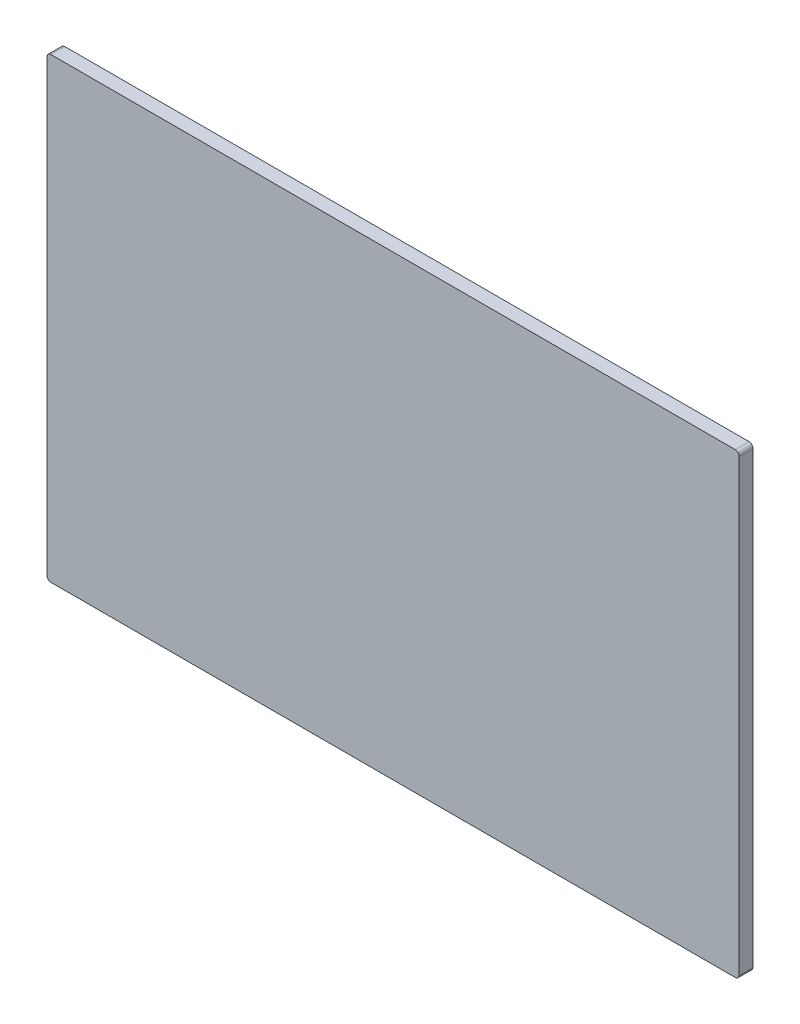
ISO-10303-21;
HEADER;
FILE_DESCRIPTION(('STEP AP214'),'2;1');
FILE_NAME('part.step','',(''),(''),'','','');
FILE_SCHEMA(('AUTOMOTIVE_DESIGN { 1 0 10303 214 1 1 1 1 }'));
ENDSEC;
DATA;
#1=APPLICATION_CONTEXT('core data for automotive mechanical design processes');
#2=APPLICATION_PROTOCOL_DEFINITION('international standard','automotive_design',2000,#1);
#3=PRODUCT_CONTEXT('',#1,'mechanical');
#4=PRODUCT('Part','Part','',(#3));
#5=PRODUCT_RELATED_PRODUCT_CATEGORY('part','',(#4));
#6=PRODUCT_DEFINITION_FORMATION('','',#4);
#7=PRODUCT_DEFINITION_CONTEXT('part definition',#1,'design');
#8=PRODUCT_DEFINITION('design','',#6,#7);
#9=PRODUCT_DEFINITION_SHAPE('','',#8);
#10=(LENGTH_UNIT() NAMED_UNIT(*) SI_UNIT(.MILLI.,.METRE.));
#11=(NAMED_UNIT(*) PLANE_ANGLE_UNIT() SI_UNIT($,.RADIAN.));
#12=(NAMED_UNIT(*) SI_UNIT($,.STERADIAN.) SOLID_ANGLE_UNIT());
#13=UNCERTAINTY_MEASURE_WITH_UNIT(LENGTH_MEASURE(1.E-05),#10,'distance_accuracy_value','');
#14=(GEOMETRIC_REPRESENTATION_CONTEXT(3) GLOBAL_UNCERTAINTY_ASSIGNED_CONTEXT((#13)) GLOBAL_UNIT_ASSIGNED_CONTEXT((#10,
#11,#12)) REPRESENTATION_CONTEXT('',''));
#15=CARTESIAN_POINT('',(0.,0.,0.));
#16=DIRECTION('',(0.,0.,1.));
#17=DIRECTION('',(1.,0.,0.));
#18=AXIS2_PLACEMENT_3D('',#15,#16,#17);
#19=CARTESIAN_POINT('',(960.,30.533000000003,17.4));
#20=DIRECTION('',(0.,0.,1.));
#21=DIRECTION('',(1.,0.,0.));
#22=AXIS2_PLACEMENT_3D('',#19,#20,#21);
#23=CYLINDRICAL_SURFACE('',#22,5.);
#24=DIRECTION('',(0.,0.,1.));
#25=VECTOR('',#24,1.);
#26=CARTESIAN_POINT('',(960.,25.533000000003,17.4));
#27=LINE('',#26,#25);
#28=CARTESIAN_POINT('',(960.,25.533000000003,0.));
#29=VERTEX_POINT('',#28);
#30=CARTESIAN_POINT('',(960.,25.533000000003,17.4));
#31=VERTEX_POINT('',#30);
#32=EDGE_CURVE('E153',#29,#31,#27,.T.);
#33=ORIENTED_EDGE('',*,*,#32,.F.);
#34=CARTESIAN_POINT('',(960.,30.533000000003,0.));
#35=DIRECTION('',(0.,0.,-1.));
#36=DIRECTION('',(-1.,0.,0.));
#37=AXIS2_PLACEMENT_3D('',#34,#35,#36);
#38=CIRCLE('',#37,5.);
#39=CARTESIAN_POINT('',(965.,30.533000000003,0.));
#40=VERTEX_POINT('',#39);
#41=EDGE_CURVE('E40',#40,#29,#38,.T.);
#42=ORIENTED_EDGE('',*,*,#41,.F.);
#43=DIRECTION('',(0.,0.,1.));
#44=VECTOR('',#43,1.);
#45=CARTESIAN_POINT('',(965.,30.533000000003,17.4));
#46=LINE('',#45,#44);
#47=CARTESIAN_POINT('',(965.,30.533000000003,17.4));
#48=VERTEX_POINT('',#47);
#49=EDGE_CURVE('E156',#48,#40,#46,.F.);
#50=ORIENTED_EDGE('',*,*,#49,.F.);
#51=CARTESIAN_POINT('',(960.,30.533000000003,17.4));
#52=DIRECTION('',(0.,0.,-1.));
#53=DIRECTION('',(-1.,0.,0.));
#54=AXIS2_PLACEMENT_3D('',#51,#52,#53);
#55=CIRCLE('',#54,5.);
#56=EDGE_CURVE('E11',#31,#48,#55,.F.);
#57=ORIENTED_EDGE('',*,*,#56,.F.);
#58=EDGE_LOOP('',(#33,#42,#50,#57));
#59=FACE_BOUND('',#58,.T.);
#60=ADVANCED_FACE('F33',(#59),#23,.T.);
#61=CARTESIAN_POINT('',(100.,30.533000000003,17.4));
#62=DIRECTION('',(0.,0.,1.));
#63=DIRECTION('',(1.,0.,0.));
#64=AXIS2_PLACEMENT_3D('',#61,#62,#63);
#65=CYLINDRICAL_SURFACE('',#64,5.);
#66=DIRECTION('',(0.,0.,1.));
#67=VECTOR('',#66,1.);
#68=CARTESIAN_POINT('',(95.,30.533000000003,17.4));
#69=LINE('',#68,#67);
#70=CARTESIAN_POINT('',(95.,30.533000000003,0.));
#71=VERTEX_POINT('',#70);
#72=CARTESIAN_POINT('',(95.,30.533000000003,17.4));
#73=VERTEX_POINT('',#72);
#74=EDGE_CURVE('E143',#71,#73,#69,.T.);
#75=ORIENTED_EDGE('',*,*,#74,.F.);
#76=CARTESIAN_POINT('',(100.,30.533000000003,0.));
#77=DIRECTION('',(0.,0.,-1.));
#78=DIRECTION('',(-1.,0.,0.));
#79=AXIS2_PLACEMENT_3D('',#76,#77,#78);
#80=CIRCLE('',#79,5.);
#81=CARTESIAN_POINT('',(100.,25.533000000003,0.));
#82=VERTEX_POINT('',#81);
#83=EDGE_CURVE('E149',#82,#71,#80,.T.);
#84=ORIENTED_EDGE('',*,*,#83,.F.);
#85=DIRECTION('',(0.,0.,1.));
#86=VECTOR('',#85,1.);
#87=CARTESIAN_POINT('',(100.,25.533000000003,17.4));
#88=LINE('',#87,#86);
#89=CARTESIAN_POINT('',(100.,25.533000000003,17.4));
#90=VERTEX_POINT('',#89);
#91=EDGE_CURVE('E146',#90,#82,#88,.F.);
#92=ORIENTED_EDGE('',*,*,#91,.F.);
#93=CARTESIAN_POINT('',(100.,30.533000000003,17.4));
#94=DIRECTION('',(0.,0.,-1.));
#95=DIRECTION('',(-1.,0.,0.));
#96=AXIS2_PLACEMENT_3D('',#93,#94,#95);
#97=CIRCLE('',#96,5.);
#98=EDGE_CURVE('E151',#73,#90,#97,.F.);
#99=ORIENTED_EDGE('',*,*,#98,.F.);
#100=EDGE_LOOP('',(#75,#84,#92,#99));
#101=FACE_BOUND('',#100,.T.);
#102=ADVANCED_FACE('F164',(#101),#65,.T.);
#103=CARTESIAN_POINT('',(99.9999999999999,595.020000000225,17.4));
#104=DIRECTION('',(0.,0.,1.));
#105=DIRECTION('',(1.,0.,0.));
#106=AXIS2_PLACEMENT_3D('',#103,#104,#105);
#107=CYLINDRICAL_SURFACE('',#106,5.);
#108=DIRECTION('',(0.,0.,1.));
#109=VECTOR('',#108,1.);
#110=CARTESIAN_POINT('',(99.9999999999999,600.020000000225,17.4));
#111=LINE('',#110,#109);
#112=CARTESIAN_POINT('',(99.9999999999999,600.020000000225,0.));
#113=VERTEX_POINT('',#112);
#114=CARTESIAN_POINT('',(99.9999999999999,600.020000000225,17.4));
#115=VERTEX_POINT('',#114);
#116=EDGE_CURVE('E106',#113,#115,#111,.T.);
#117=ORIENTED_EDGE('',*,*,#116,.F.);
#118=CARTESIAN_POINT('',(99.9999999999999,595.020000000225,0.));
#119=DIRECTION('',(0.,0.,-1.));
#120=DIRECTION('',(-1.,0.,0.));
#121=AXIS2_PLACEMENT_3D('',#118,#119,#120);
#122=CIRCLE('',#121,5.);
#123=CARTESIAN_POINT('',(94.9999999999999,595.020000000225,0.));
#124=VERTEX_POINT('',#123);
#125=EDGE_CURVE('E120',#124,#113,#122,.T.);
#126=ORIENTED_EDGE('',*,*,#125,.F.);
#127=DIRECTION('',(0.,0.,1.));
#128=VECTOR('',#127,1.);
#129=CARTESIAN_POINT('',(94.9999999999999,595.020000000225,17.4));
#130=LINE('',#129,#128);
#131=CARTESIAN_POINT('',(94.9999999999999,595.020000000225,17.4));
#132=VERTEX_POINT('',#131);
#133=EDGE_CURVE('E137',#132,#124,#130,.F.);
#134=ORIENTED_EDGE('',*,*,#133,.F.);
#135=CARTESIAN_POINT('',(99.9999999999999,595.020000000225,17.4));
#136=DIRECTION('',(0.,0.,-1.));
#137=DIRECTION('',(-1.,0.,0.));
#138=AXIS2_PLACEMENT_3D('',#135,#136,#137);
#139=CIRCLE('',#138,5.);
#140=EDGE_CURVE('E141',#115,#132,#139,.F.);
#141=ORIENTED_EDGE('',*,*,#140,.F.);
#142=EDGE_LOOP('',(#117,#126,#134,#141));
#143=FACE_BOUND('',#142,.T.);
#144=ADVANCED_FACE('F172',(#143),#107,.T.);
#145=CARTESIAN_POINT('',(960.,595.020000000225,17.4));
#146=DIRECTION('',(0.,0.,-1.));
#147=DIRECTION('',(-1.,0.,0.));
#148=AXIS2_PLACEMENT_3D('',#145,#146,#147);
#149=CYLINDRICAL_SURFACE('',#148,5.);
#150=DIRECTION('',(0.,0.,-1.));
#151=VECTOR('',#150,1.);
#152=CARTESIAN_POINT('',(960.,600.020000000225,17.4));
#153=LINE('',#152,#151);
#154=CARTESIAN_POINT('',(960.,600.020000000225,17.4));
#155=VERTEX_POINT('',#154);
#156=CARTESIAN_POINT('',(960.,600.020000000225,0.));
#157=VERTEX_POINT('',#156);
#158=EDGE_CURVE('E99',#155,#157,#153,.T.);
#159=ORIENTED_EDGE('',*,*,#158,.F.);
#160=CARTESIAN_POINT('',(960.,595.020000000225,17.4));
#161=DIRECTION('',(0.,0.,-1.));
#162=DIRECTION('',(-1.,0.,0.));
#163=AXIS2_PLACEMENT_3D('',#160,#161,#162);
#164=CIRCLE('',#163,5.);
#165=CARTESIAN_POINT('',(965.,595.020000000225,17.4));
#166=VERTEX_POINT('',#165);
#167=EDGE_CURVE('E107',#166,#155,#164,.F.);
#168=ORIENTED_EDGE('',*,*,#167,.F.);
#169=DIRECTION('',(0.,0.,-1.));
#170=VECTOR('',#169,1.);
#171=CARTESIAN_POINT('',(965.,595.020000000225,17.4));
#172=LINE('',#171,#170);
#173=CARTESIAN_POINT('',(965.,595.020000000225,0.));
#174=VERTEX_POINT('',#173);
#175=EDGE_CURVE('E102',#174,#166,#172,.F.);
#176=ORIENTED_EDGE('',*,*,#175,.F.);
#177=CARTESIAN_POINT('',(960.,595.020000000225,0.));
#178=DIRECTION('',(0.,0.,-1.));
#179=DIRECTION('',(-1.,0.,0.));
#180=AXIS2_PLACEMENT_3D('',#177,#178,#179);
#181=CIRCLE('',#180,5.);
#182=EDGE_CURVE('E95',#157,#174,#181,.T.);
#183=ORIENTED_EDGE('',*,*,#182,.F.);
#184=EDGE_LOOP('',(#159,#168,#176,#183));
#185=FACE_BOUND('',#184,.T.);
#186=ADVANCED_FACE('F97',(#185),#149,.T.);
#187=CARTESIAN_POINT('',(965.,25.533000000003,17.4));
#188=DIRECTION('',(-1.,0.,0.));
#189=DIRECTION('',(0.,-1.,0.));
#190=AXIS2_PLACEMENT_3D('',#187,#188,#189);
#191=PLANE('',#190);
#192=DIRECTION('',(0.,1.,0.));
#193=VECTOR('',#192,1.);
#194=CARTESIAN_POINT('',(965.,25.533000000003,17.4));
#195=LINE('',#194,#193);
#196=EDGE_CURVE('E132',#48,#166,#195,.T.);
#197=ORIENTED_EDGE('',*,*,#196,.F.);
#198=ORIENTED_EDGE('',*,*,#49,.T.);
#199=DIRECTION('',(0.,1.,0.));
#200=VECTOR('',#199,1.);
#201=CARTESIAN_POINT('',(965.,25.533000000003,0.));
#202=LINE('',#201,#200);
#203=EDGE_CURVE('E123',#40,#174,#202,.T.);
#204=ORIENTED_EDGE('',*,*,#203,.T.);
#205=ORIENTED_EDGE('',*,*,#175,.T.);
#206=EDGE_LOOP('',(#197,#198,#204,#205));
#207=FACE_BOUND('',#206,.T.);
#208=ADVANCED_FACE('F179',(#207),#191,.F.);
#209=CARTESIAN_POINT('',(94.9999999999999,600.020000000225,17.4));
#210=DIRECTION('',(0.,-1.,0.));
#211=DIRECTION('',(0.,0.,-1.));
#212=AXIS2_PLACEMENT_3D('',#209,#210,#211);
#213=PLANE('',#212);
#214=DIRECTION('',(-1.,0.,0.));
#215=VECTOR('',#214,1.);
#216=CARTESIAN_POINT('',(94.9999999999999,600.020000000225,0.));
#217=LINE('',#216,#215);
#218=EDGE_CURVE('E113',#157,#113,#217,.T.);
#219=ORIENTED_EDGE('',*,*,#218,.T.);
#220=ORIENTED_EDGE('',*,*,#116,.T.);
#221=DIRECTION('',(-1.,0.,0.));
#222=VECTOR('',#221,1.);
#223=CARTESIAN_POINT('',(94.9999999999999,600.020000000225,17.4));
#224=LINE('',#223,#222);
#225=EDGE_CURVE('E115',#155,#115,#224,.T.);
#226=ORIENTED_EDGE('',*,*,#225,.F.);
#227=ORIENTED_EDGE('',*,*,#158,.T.);
#228=EDGE_LOOP('',(#219,#220,#226,#227));
#229=FACE_BOUND('',#228,.T.);
#230=ADVANCED_FACE('F111',(#229),#213,.F.);
#231=CARTESIAN_POINT('',(95.,25.533000000003,17.4));
#232=DIRECTION('',(1.,0.,0.));
#233=DIRECTION('',(0.,1.,0.));
#234=AXIS2_PLACEMENT_3D('',#231,#232,#233);
#235=PLANE('',#234);
#236=DIRECTION('',(0.,-1.,0.));
#237=VECTOR('',#236,1.);
#238=CARTESIAN_POINT('',(95.,25.533000000003,0.));
#239=LINE('',#238,#237);
#240=EDGE_CURVE('E122',#124,#71,#239,.T.);
#241=ORIENTED_EDGE('',*,*,#240,.T.);
#242=ORIENTED_EDGE('',*,*,#74,.T.);
#243=DIRECTION('',(0.,-1.,0.));
#244=VECTOR('',#243,1.);
#245=CARTESIAN_POINT('',(95.,25.533000000003,17.4));
#246=LINE('',#245,#244);
#247=EDGE_CURVE('E170',#132,#73,#246,.T.);
#248=ORIENTED_EDGE('',*,*,#247,.F.);
#249=ORIENTED_EDGE('',*,*,#133,.T.);
#250=EDGE_LOOP('',(#241,#242,#248,#249));
#251=FACE_BOUND('',#250,.T.);
#252=ADVANCED_FACE('F166',(#251),#235,.F.);
#253=CARTESIAN_POINT('',(95.,25.533000000003,17.4));
#254=DIRECTION('',(0.,1.,0.));
#255=DIRECTION('',(0.,0.,1.));
#256=AXIS2_PLACEMENT_3D('',#253,#254,#255);
#257=PLANE('',#256);
#258=DIRECTION('',(1.,0.,0.));
#259=VECTOR('',#258,1.);
#260=CARTESIAN_POINT('',(95.,25.533000000003,0.));
#261=LINE('',#260,#259);
#262=EDGE_CURVE('E126',#82,#29,#261,.T.);
#263=ORIENTED_EDGE('',*,*,#262,.T.);
#264=ORIENTED_EDGE('',*,*,#32,.T.);
#265=DIRECTION('',(1.,0.,0.));
#266=VECTOR('',#265,1.);
#267=CARTESIAN_POINT('',(95.,25.533000000003,17.4));
#268=LINE('',#267,#266);
#269=EDGE_CURVE('E116',#90,#31,#268,.T.);
#270=ORIENTED_EDGE('',*,*,#269,.F.);
#271=ORIENTED_EDGE('',*,*,#91,.T.);
#272=EDGE_LOOP('',(#263,#264,#270,#271));
#273=FACE_BOUND('',#272,.T.);
#274=ADVANCED_FACE('F160',(#273),#257,.F.);
#275=CARTESIAN_POINT('',(0.,0.,17.4));
#276=DIRECTION('',(0.,0.,-1.));
#277=DIRECTION('',(-1.,0.,0.));
#278=AXIS2_PLACEMENT_3D('',#275,#276,#277);
#279=PLANE('',#278);
#280=ORIENTED_EDGE('',*,*,#269,.T.);
#281=ORIENTED_EDGE('',*,*,#56,.T.);
#282=ORIENTED_EDGE('',*,*,#196,.T.);
#283=ORIENTED_EDGE('',*,*,#167,.T.);
#284=ORIENTED_EDGE('',*,*,#225,.T.);
#285=ORIENTED_EDGE('',*,*,#140,.T.);
#286=ORIENTED_EDGE('',*,*,#247,.T.);
#287=ORIENTED_EDGE('',*,*,#98,.T.);
#288=EDGE_LOOP('',(#280,#281,#282,#283,#284,#285,#286,#287));
#289=FACE_BOUND('',#288,.T.);
#290=ADVANCED_FACE('F173',(#289),#279,.F.);
#291=CARTESIAN_POINT('',(0.,0.,0.));
#292=DIRECTION('',(0.,0.,-1.));
#293=DIRECTION('',(-1.,0.,0.));
#294=AXIS2_PLACEMENT_3D('',#291,#292,#293);
#295=PLANE('',#294);
#296=ORIENTED_EDGE('',*,*,#203,.F.);
#297=ORIENTED_EDGE('',*,*,#41,.T.);
#298=ORIENTED_EDGE('',*,*,#262,.F.);
#299=ORIENTED_EDGE('',*,*,#83,.T.);
#300=ORIENTED_EDGE('',*,*,#240,.F.);
#301=ORIENTED_EDGE('',*,*,#125,.T.);
#302=ORIENTED_EDGE('',*,*,#218,.F.);
#303=ORIENTED_EDGE('',*,*,#182,.T.);
#304=EDGE_LOOP('',(#296,#297,#298,#299,#300,#301,#302,#303));
#305=FACE_BOUND('',#304,.T.);
#306=ADVANCED_FACE('F118',(#305),#295,.T.);
#307=CLOSED_SHELL('',(#60,#102,#144,#186,#208,#230,#252,#274,#290,#306));
#308=MANIFOLD_SOLID_BREP('B2',#307);
#309=ADVANCED_BREP_SHAPE_REPRESENTATION('',(#18,#308),#14);
#310=SHAPE_DEFINITION_REPRESENTATION(#9,#309);
ENDSEC;
END-ISO-10303-21;
